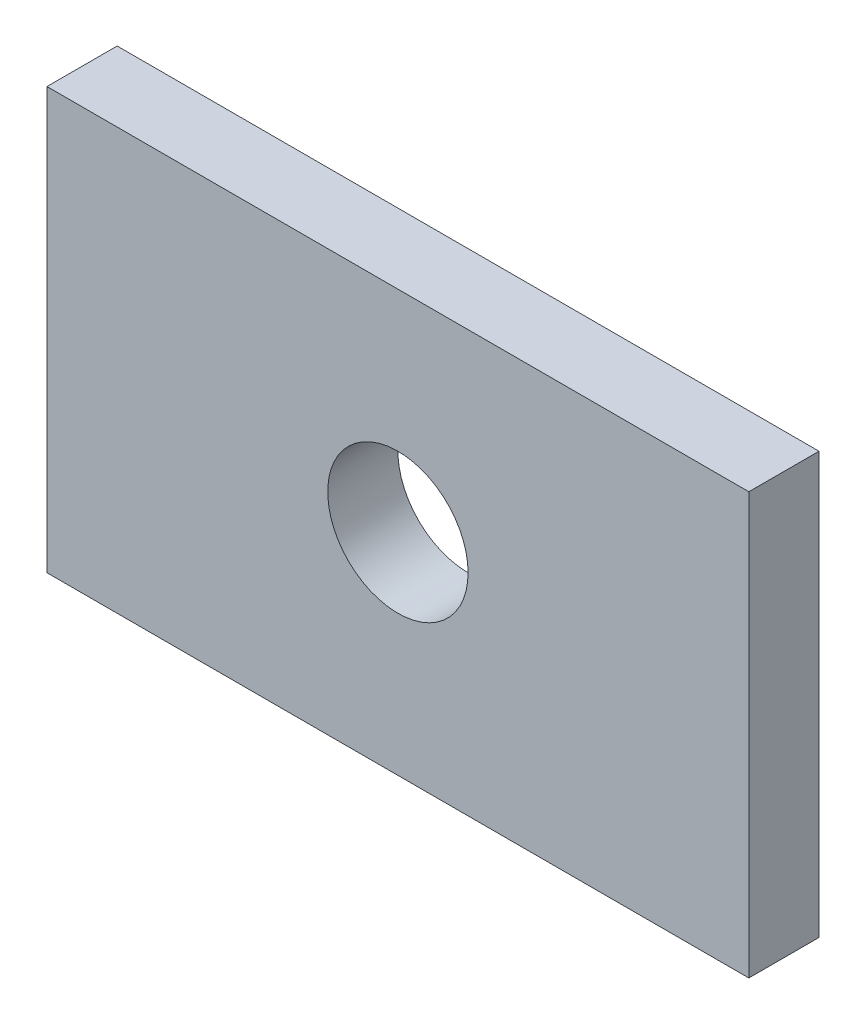
ISO-10303-21;
HEADER;
FILE_DESCRIPTION(('STEP AP214'),'2;1');
FILE_NAME('part.step','',(''),(''),'','','');
FILE_SCHEMA(('AUTOMOTIVE_DESIGN { 1 0 10303 214 1 1 1 1 }'));
ENDSEC;
DATA;
#1=APPLICATION_CONTEXT('core data for automotive mechanical design processes');
#2=APPLICATION_PROTOCOL_DEFINITION('international standard','automotive_design',2000,#1);
#3=PRODUCT_CONTEXT('',#1,'mechanical');
#4=PRODUCT('Part','Part','',(#3));
#5=PRODUCT_RELATED_PRODUCT_CATEGORY('part','',(#4));
#6=PRODUCT_DEFINITION_FORMATION('','',#4);
#7=PRODUCT_DEFINITION_CONTEXT('part definition',#1,'design');
#8=PRODUCT_DEFINITION('design','',#6,#7);
#9=PRODUCT_DEFINITION_SHAPE('','',#8);
#10=(LENGTH_UNIT() NAMED_UNIT(*) SI_UNIT(.MILLI.,.METRE.));
#11=(NAMED_UNIT(*) PLANE_ANGLE_UNIT() SI_UNIT($,.RADIAN.));
#12=(NAMED_UNIT(*) SI_UNIT($,.STERADIAN.) SOLID_ANGLE_UNIT());
#13=UNCERTAINTY_MEASURE_WITH_UNIT(LENGTH_MEASURE(1.E-05),#10,'distance_accuracy_value','');
#14=(GEOMETRIC_REPRESENTATION_CONTEXT(3) GLOBAL_UNCERTAINTY_ASSIGNED_CONTEXT((#13)) GLOBAL_UNIT_ASSIGNED_CONTEXT((#10,
#11,#12)) REPRESENTATION_CONTEXT('',''));
#15=CARTESIAN_POINT('',(0.,0.,0.));
#16=DIRECTION('',(0.,0.,1.));
#17=DIRECTION('',(1.,0.,0.));
#18=AXIS2_PLACEMENT_3D('',#15,#16,#17);
#19=CARTESIAN_POINT('',(0.,0.,10.));
#20=DIRECTION('',(0.,0.,-1.));
#21=DIRECTION('',(-1.,0.,0.));
#22=AXIS2_PLACEMENT_3D('',#19,#20,#21);
#23=PLANE('',#22);
#24=DIRECTION('',(0.,-1.,0.));
#25=VECTOR('',#24,1.);
#26=CARTESIAN_POINT('',(-50.,30.,10.));
#27=LINE('',#26,#25);
#28=CARTESIAN_POINT('',(-50.,30.,10.));
#29=VERTEX_POINT('',#28);
#30=CARTESIAN_POINT('',(-50.,-30.,10.));
#31=VERTEX_POINT('',#30);
#32=EDGE_CURVE('E93',#29,#31,#27,.T.);
#33=ORIENTED_EDGE('',*,*,#32,.T.);
#34=DIRECTION('',(1.,0.,0.));
#35=VECTOR('',#34,1.);
#36=CARTESIAN_POINT('',(50.,-30.,10.));
#37=LINE('',#36,#35);
#38=CARTESIAN_POINT('',(50.,-30.,10.));
#39=VERTEX_POINT('',#38);
#40=EDGE_CURVE('E88',#31,#39,#37,.T.);
#41=ORIENTED_EDGE('',*,*,#40,.T.);
#42=DIRECTION('',(0.,1.,0.));
#43=VECTOR('',#42,1.);
#44=CARTESIAN_POINT('',(50.,30.,10.));
#45=LINE('',#44,#43);
#46=CARTESIAN_POINT('',(50.,30.,10.));
#47=VERTEX_POINT('',#46);
#48=EDGE_CURVE('E90',#39,#47,#45,.T.);
#49=ORIENTED_EDGE('',*,*,#48,.T.);
#50=DIRECTION('',(-1.,0.,0.));
#51=VECTOR('',#50,1.);
#52=CARTESIAN_POINT('',(50.,30.,10.));
#53=LINE('',#52,#51);
#54=EDGE_CURVE('E57',#47,#29,#53,.T.);
#55=ORIENTED_EDGE('',*,*,#54,.T.);
#56=EDGE_LOOP('',(#33,#41,#49,#55));
#57=FACE_BOUND('',#56,.T.);
#58=CARTESIAN_POINT('',(0.,0.,10.));
#59=DIRECTION('',(0.,0.,1.));
#60=DIRECTION('',(1.,0.,0.));
#61=AXIS2_PLACEMENT_3D('',#58,#59,#60);
#62=CIRCLE('',#61,10.);
#63=CARTESIAN_POINT('',(9.99999999999999,0.,10.));
#64=VERTEX_POINT('',#63);
#65=EDGE_CURVE('E106',#64,#64,#62,.T.);
#66=ORIENTED_EDGE('',*,*,#65,.F.);
#67=EDGE_LOOP('',(#66));
#68=FACE_BOUND('',#67,.T.);
#69=ADVANCED_FACE('F39',(#57,#68),#23,.F.);
#70=CARTESIAN_POINT('',(0.,0.,0.));
#71=DIRECTION('',(0.,0.,-1.));
#72=DIRECTION('',(-1.,0.,0.));
#73=AXIS2_PLACEMENT_3D('',#70,#71,#72);
#74=PLANE('',#73);
#75=DIRECTION('',(0.,-1.,0.));
#76=VECTOR('',#75,1.);
#77=CARTESIAN_POINT('',(-50.,30.,0.));
#78=LINE('',#77,#76);
#79=CARTESIAN_POINT('',(-50.,30.,0.));
#80=VERTEX_POINT('',#79);
#81=CARTESIAN_POINT('',(-50.,-30.,0.));
#82=VERTEX_POINT('',#81);
#83=EDGE_CURVE('E103',#80,#82,#78,.T.);
#84=ORIENTED_EDGE('',*,*,#83,.F.);
#85=DIRECTION('',(-1.,0.,0.));
#86=VECTOR('',#85,1.);
#87=CARTESIAN_POINT('',(50.,30.,0.));
#88=LINE('',#87,#86);
#89=CARTESIAN_POINT('',(50.,30.,0.));
#90=VERTEX_POINT('',#89);
#91=EDGE_CURVE('E76',#90,#80,#88,.T.);
#92=ORIENTED_EDGE('',*,*,#91,.F.);
#93=DIRECTION('',(0.,1.,0.));
#94=VECTOR('',#93,1.);
#95=CARTESIAN_POINT('',(50.,30.,0.));
#96=LINE('',#95,#94);
#97=CARTESIAN_POINT('',(50.,-30.,0.));
#98=VERTEX_POINT('',#97);
#99=EDGE_CURVE('E71',#98,#90,#96,.T.);
#100=ORIENTED_EDGE('',*,*,#99,.F.);
#101=DIRECTION('',(1.,0.,0.));
#102=VECTOR('',#101,1.);
#103=CARTESIAN_POINT('',(50.,-30.,0.));
#104=LINE('',#103,#102);
#105=EDGE_CURVE('E92',#82,#98,#104,.T.);
#106=ORIENTED_EDGE('',*,*,#105,.F.);
#107=EDGE_LOOP('',(#84,#92,#100,#106));
#108=FACE_BOUND('',#107,.T.);
#109=CARTESIAN_POINT('',(0.,0.,0.));
#110=DIRECTION('',(0.,0.,1.));
#111=DIRECTION('',(1.,0.,0.));
#112=AXIS2_PLACEMENT_3D('',#109,#110,#111);
#113=CIRCLE('',#112,10.);
#114=CARTESIAN_POINT('',(9.99999999999999,0.,0.));
#115=VERTEX_POINT('',#114);
#116=EDGE_CURVE('E119',#115,#115,#113,.T.);
#117=ORIENTED_EDGE('',*,*,#116,.T.);
#118=EDGE_LOOP('',(#117));
#119=FACE_BOUND('',#118,.T.);
#120=ADVANCED_FACE('F111',(#108,#119),#74,.T.);
#121=CARTESIAN_POINT('',(-50.,30.,10.));
#122=DIRECTION('',(1.,0.,0.));
#123=DIRECTION('',(0.,1.,0.));
#124=AXIS2_PLACEMENT_3D('',#121,#122,#123);
#125=PLANE('',#124);
#126=ORIENTED_EDGE('',*,*,#83,.T.);
#127=DIRECTION('',(0.,0.,-1.));
#128=VECTOR('',#127,1.);
#129=CARTESIAN_POINT('',(-50.,-30.,10.));
#130=LINE('',#129,#128);
#131=EDGE_CURVE('E11',#31,#82,#130,.T.);
#132=ORIENTED_EDGE('',*,*,#131,.F.);
#133=ORIENTED_EDGE('',*,*,#32,.F.);
#134=DIRECTION('',(0.,0.,-1.));
#135=VECTOR('',#134,1.);
#136=CARTESIAN_POINT('',(-50.,30.,10.));
#137=LINE('',#136,#135);
#138=EDGE_CURVE('E97',#29,#80,#137,.T.);
#139=ORIENTED_EDGE('',*,*,#138,.T.);
#140=EDGE_LOOP('',(#126,#132,#133,#139));
#141=FACE_BOUND('',#140,.T.);
#142=ADVANCED_FACE('F41',(#141),#125,.F.);
#143=CARTESIAN_POINT('',(50.,-30.,10.));
#144=DIRECTION('',(0.,1.,0.));
#145=DIRECTION('',(-1.,0.,0.));
#146=AXIS2_PLACEMENT_3D('',#143,#144,#145);
#147=PLANE('',#146);
#148=ORIENTED_EDGE('',*,*,#105,.T.);
#149=DIRECTION('',(0.,0.,-1.));
#150=VECTOR('',#149,1.);
#151=CARTESIAN_POINT('',(50.,-30.,10.));
#152=LINE('',#151,#150);
#153=EDGE_CURVE('E48',#39,#98,#152,.T.);
#154=ORIENTED_EDGE('',*,*,#153,.F.);
#155=ORIENTED_EDGE('',*,*,#40,.F.);
#156=ORIENTED_EDGE('',*,*,#131,.T.);
#157=EDGE_LOOP('',(#148,#154,#155,#156));
#158=FACE_BOUND('',#157,.T.);
#159=ADVANCED_FACE('F94',(#158),#147,.F.);
#160=CARTESIAN_POINT('',(50.,30.,10.));
#161=DIRECTION('',(-1.,0.,0.));
#162=DIRECTION('',(0.,-1.,0.));
#163=AXIS2_PLACEMENT_3D('',#160,#161,#162);
#164=PLANE('',#163);
#165=ORIENTED_EDGE('',*,*,#99,.T.);
#166=DIRECTION('',(0.,0.,-1.));
#167=VECTOR('',#166,1.);
#168=CARTESIAN_POINT('',(50.,30.,10.));
#169=LINE('',#168,#167);
#170=EDGE_CURVE('E96',#47,#90,#169,.T.);
#171=ORIENTED_EDGE('',*,*,#170,.F.);
#172=ORIENTED_EDGE('',*,*,#48,.F.);
#173=ORIENTED_EDGE('',*,*,#153,.T.);
#174=EDGE_LOOP('',(#165,#171,#172,#173));
#175=FACE_BOUND('',#174,.T.);
#176=ADVANCED_FACE('F100',(#175),#164,.F.);
#177=CARTESIAN_POINT('',(50.,30.,10.));
#178=DIRECTION('',(0.,-1.,0.));
#179=DIRECTION('',(1.,0.,0.));
#180=AXIS2_PLACEMENT_3D('',#177,#178,#179);
#181=PLANE('',#180);
#182=ORIENTED_EDGE('',*,*,#91,.T.);
#183=ORIENTED_EDGE('',*,*,#138,.F.);
#184=ORIENTED_EDGE('',*,*,#54,.F.);
#185=ORIENTED_EDGE('',*,*,#170,.T.);
#186=EDGE_LOOP('',(#182,#183,#184,#185));
#187=FACE_BOUND('',#186,.T.);
#188=ADVANCED_FACE('F112',(#187),#181,.F.);
#189=CARTESIAN_POINT('',(0.,0.,10.));
#190=DIRECTION('',(0.,0.,-1.));
#191=DIRECTION('',(-1.,0.,0.));
#192=AXIS2_PLACEMENT_3D('',#189,#190,#191);
#193=CYLINDRICAL_SURFACE('',#192,10.);
#194=ORIENTED_EDGE('',*,*,#65,.T.);
#195=EDGE_LOOP('',(#194));
#196=FACE_BOUND('',#195,.T.);
#197=ORIENTED_EDGE('',*,*,#116,.F.);
#198=EDGE_LOOP('',(#197));
#199=FACE_BOUND('',#198,.T.);
#200=ADVANCED_FACE('F121',(#196,#199),#193,.F.);
#201=CLOSED_SHELL('',(#69,#120,#142,#159,#176,#188,#200));
#202=MANIFOLD_SOLID_BREP('B2',#201);
#203=ADVANCED_BREP_SHAPE_REPRESENTATION('',(#18,#202),#14);
#204=SHAPE_DEFINITION_REPRESENTATION(#9,#203);
ENDSEC;
END-ISO-10303-21;
